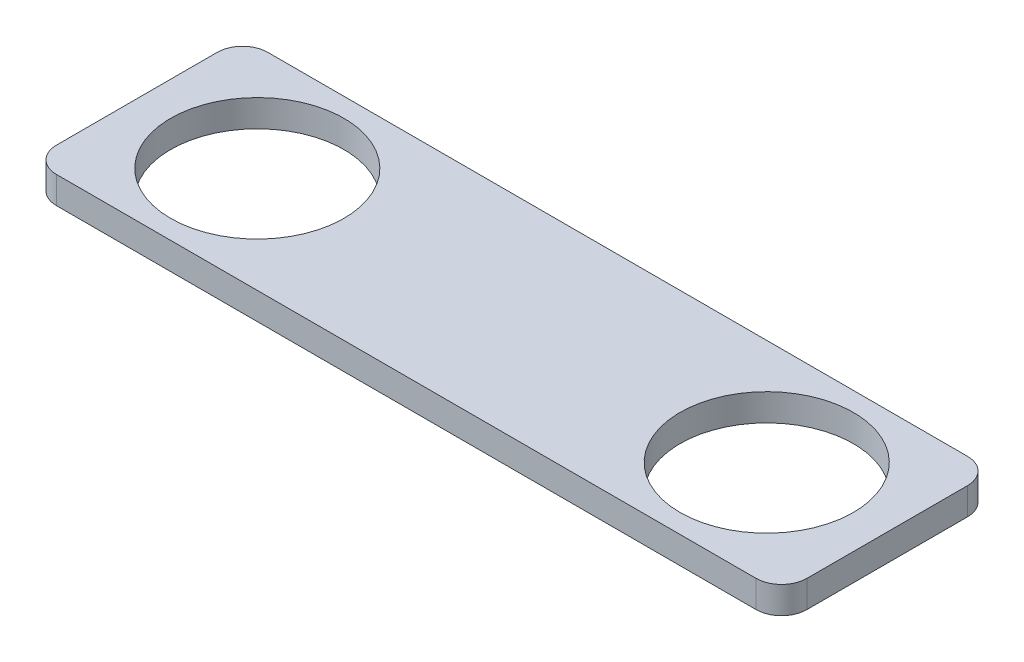
ISO-10303-21;
HEADER;
FILE_DESCRIPTION(('STEP AP214'),'2;1');
FILE_NAME('part.step','',(''),(''),'','','');
FILE_SCHEMA(('AUTOMOTIVE_DESIGN { 1 0 10303 214 1 1 1 1 }'));
ENDSEC;
DATA;
#1=APPLICATION_CONTEXT('core data for automotive mechanical design processes');
#2=APPLICATION_PROTOCOL_DEFINITION('international standard','automotive_design',2000,#1);
#3=PRODUCT_CONTEXT('',#1,'mechanical');
#4=PRODUCT('Part','Part','',(#3));
#5=PRODUCT_RELATED_PRODUCT_CATEGORY('part','',(#4));
#6=PRODUCT_DEFINITION_FORMATION('','',#4);
#7=PRODUCT_DEFINITION_CONTEXT('part definition',#1,'design');
#8=PRODUCT_DEFINITION('design','',#6,#7);
#9=PRODUCT_DEFINITION_SHAPE('','',#8);
#10=(LENGTH_UNIT() NAMED_UNIT(*) SI_UNIT(.MILLI.,.METRE.));
#11=(NAMED_UNIT(*) PLANE_ANGLE_UNIT() SI_UNIT($,.RADIAN.));
#12=(NAMED_UNIT(*) SI_UNIT($,.STERADIAN.) SOLID_ANGLE_UNIT());
#13=UNCERTAINTY_MEASURE_WITH_UNIT(LENGTH_MEASURE(1.E-05),#10,'distance_accuracy_value','');
#14=(GEOMETRIC_REPRESENTATION_CONTEXT(3) GLOBAL_UNCERTAINTY_ASSIGNED_CONTEXT((#13)) GLOBAL_UNIT_ASSIGNED_CONTEXT((#10,
#11,#12)) REPRESENTATION_CONTEXT('',''));
#15=CARTESIAN_POINT('',(0.,0.,0.));
#16=DIRECTION('',(0.,0.,1.));
#17=DIRECTION('',(1.,0.,0.));
#18=AXIS2_PLACEMENT_3D('',#15,#16,#17);
#19=CARTESIAN_POINT('',(-44.368,3.2,12.5));
#20=DIRECTION('',(1.,0.,0.));
#21=DIRECTION('',(0.,0.,1.));
#22=AXIS2_PLACEMENT_3D('',#19,#20,#21);
#23=PLANE('',#22);
#24=DIRECTION('',(0.,0.,1.));
#25=VECTOR('',#24,1.);
#26=CARTESIAN_POINT('',(-44.368,3.2,12.5));
#27=LINE('',#26,#25);
#28=CARTESIAN_POINT('',(-44.368,3.2,-9.5));
#29=VERTEX_POINT('',#28);
#30=CARTESIAN_POINT('',(-44.368,3.2,9.5));
#31=VERTEX_POINT('',#30);
#32=EDGE_CURVE('E164',#29,#31,#27,.T.);
#33=ORIENTED_EDGE('',*,*,#32,.F.);
#34=DIRECTION('',(0.,-1.,0.));
#35=VECTOR('',#34,1.);
#36=CARTESIAN_POINT('',(-44.368,3.2,-9.5));
#37=LINE('',#36,#35);
#38=CARTESIAN_POINT('',(-44.368,0.,-9.5));
#39=VERTEX_POINT('',#38);
#40=EDGE_CURVE('E11',#29,#39,#37,.T.);
#41=ORIENTED_EDGE('',*,*,#40,.T.);
#42=DIRECTION('',(0.,0.,-1.));
#43=VECTOR('',#42,1.);
#44=CARTESIAN_POINT('',(-44.368,0.,0.));
#45=LINE('',#44,#43);
#46=CARTESIAN_POINT('',(-44.368,0.,9.5));
#47=VERTEX_POINT('',#46);
#48=EDGE_CURVE('E165',#39,#47,#45,.F.);
#49=ORIENTED_EDGE('',*,*,#48,.T.);
#50=DIRECTION('',(0.,-1.,0.));
#51=VECTOR('',#50,1.);
#52=CARTESIAN_POINT('',(-44.368,3.2,9.5));
#53=LINE('',#52,#51);
#54=EDGE_CURVE('E58',#47,#31,#53,.F.);
#55=ORIENTED_EDGE('',*,*,#54,.T.);
#56=EDGE_LOOP('',(#33,#41,#49,#55));
#57=FACE_BOUND('',#56,.T.);
#58=ADVANCED_FACE('F49',(#57),#23,.F.);
#59=CARTESIAN_POINT('',(-44.368,3.2,12.5));
#60=DIRECTION('',(0.,0.,-1.));
#61=DIRECTION('',(1.,0.,0.));
#62=AXIS2_PLACEMENT_3D('',#59,#60,#61);
#63=PLANE('',#62);
#64=DIRECTION('',(1.,0.,0.));
#65=VECTOR('',#64,1.);
#66=CARTESIAN_POINT('',(0.,0.,12.5));
#67=LINE('',#66,#65);
#68=CARTESIAN_POINT('',(-41.368,0.,12.5));
#69=VERTEX_POINT('',#68);
#70=CARTESIAN_POINT('',(41.368,0.,12.5));
#71=VERTEX_POINT('',#70);
#72=EDGE_CURVE('E192',#69,#71,#67,.T.);
#73=ORIENTED_EDGE('',*,*,#72,.T.);
#74=DIRECTION('',(0.,-1.,0.));
#75=VECTOR('',#74,1.);
#76=CARTESIAN_POINT('',(41.368,3.2,12.5));
#77=LINE('',#76,#75);
#78=CARTESIAN_POINT('',(41.368,3.2,12.5));
#79=VERTEX_POINT('',#78);
#80=EDGE_CURVE('E143',#71,#79,#77,.F.);
#81=ORIENTED_EDGE('',*,*,#80,.T.);
#82=DIRECTION('',(1.,0.,0.));
#83=VECTOR('',#82,1.);
#84=CARTESIAN_POINT('',(-44.368,3.2,12.5));
#85=LINE('',#84,#83);
#86=CARTESIAN_POINT('',(-41.368,3.2,12.5));
#87=VERTEX_POINT('',#86);
#88=EDGE_CURVE('E176',#87,#79,#85,.T.);
#89=ORIENTED_EDGE('',*,*,#88,.F.);
#90=DIRECTION('',(0.,-1.,0.));
#91=VECTOR('',#90,1.);
#92=CARTESIAN_POINT('',(-41.368,3.2,12.5));
#93=LINE('',#92,#91);
#94=EDGE_CURVE('E150',#87,#69,#93,.T.);
#95=ORIENTED_EDGE('',*,*,#94,.T.);
#96=EDGE_LOOP('',(#73,#81,#89,#95));
#97=FACE_BOUND('',#96,.T.);
#98=ADVANCED_FACE('F227',(#97),#63,.F.);
#99=CARTESIAN_POINT('',(44.368,3.2,12.5));
#100=DIRECTION('',(-1.,0.,0.));
#101=DIRECTION('',(0.,0.,-1.));
#102=AXIS2_PLACEMENT_3D('',#99,#100,#101);
#103=PLANE('',#102);
#104=DIRECTION('',(0.,0.,-1.));
#105=VECTOR('',#104,1.);
#106=CARTESIAN_POINT('',(44.368,0.,0.));
#107=LINE('',#106,#105);
#108=CARTESIAN_POINT('',(44.368,0.,9.5));
#109=VERTEX_POINT('',#108);
#110=CARTESIAN_POINT('',(44.368,0.,-9.5));
#111=VERTEX_POINT('',#110);
#112=EDGE_CURVE('E120',#109,#111,#107,.T.);
#113=ORIENTED_EDGE('',*,*,#112,.T.);
#114=DIRECTION('',(0.,-1.,0.));
#115=VECTOR('',#114,1.);
#116=CARTESIAN_POINT('',(44.368,3.2,-9.5));
#117=LINE('',#116,#115);
#118=CARTESIAN_POINT('',(44.368,3.2,-9.5));
#119=VERTEX_POINT('',#118);
#120=EDGE_CURVE('E127',#111,#119,#117,.F.);
#121=ORIENTED_EDGE('',*,*,#120,.T.);
#122=DIRECTION('',(0.,0.,-1.));
#123=VECTOR('',#122,1.);
#124=CARTESIAN_POINT('',(44.368,3.2,12.5));
#125=LINE('',#124,#123);
#126=CARTESIAN_POINT('',(44.368,3.2,9.5));
#127=VERTEX_POINT('',#126);
#128=EDGE_CURVE('E123',#127,#119,#125,.T.);
#129=ORIENTED_EDGE('',*,*,#128,.F.);
#130=DIRECTION('',(0.,-1.,0.));
#131=VECTOR('',#130,1.);
#132=CARTESIAN_POINT('',(44.368,3.2,9.5));
#133=LINE('',#132,#131);
#134=EDGE_CURVE('E116',#127,#109,#133,.T.);
#135=ORIENTED_EDGE('',*,*,#134,.T.);
#136=EDGE_LOOP('',(#113,#121,#129,#135));
#137=FACE_BOUND('',#136,.T.);
#138=ADVANCED_FACE('F118',(#137),#103,.F.);
#139=CARTESIAN_POINT('',(-44.368,3.2,-12.5));
#140=DIRECTION('',(0.,0.,1.));
#141=DIRECTION('',(-1.,0.,0.));
#142=AXIS2_PLACEMENT_3D('',#139,#140,#141);
#143=PLANE('',#142);
#144=DIRECTION('',(-1.,0.,0.));
#145=VECTOR('',#144,1.);
#146=CARTESIAN_POINT('',(-44.368,3.2,-12.5));
#147=LINE('',#146,#145);
#148=CARTESIAN_POINT('',(41.368,3.2,-12.5));
#149=VERTEX_POINT('',#148);
#150=CARTESIAN_POINT('',(-41.368,3.2,-12.5));
#151=VERTEX_POINT('',#150);
#152=EDGE_CURVE('E177',#149,#151,#147,.T.);
#153=ORIENTED_EDGE('',*,*,#152,.F.);
#154=DIRECTION('',(0.,-1.,0.));
#155=VECTOR('',#154,1.);
#156=CARTESIAN_POINT('',(41.368,3.2,-12.5));
#157=LINE('',#156,#155);
#158=CARTESIAN_POINT('',(41.368,0.,-12.5));
#159=VERTEX_POINT('',#158);
#160=EDGE_CURVE('E221',#149,#159,#157,.T.);
#161=ORIENTED_EDGE('',*,*,#160,.T.);
#162=DIRECTION('',(1.,0.,0.));
#163=VECTOR('',#162,1.);
#164=CARTESIAN_POINT('',(0.,0.,-12.5));
#165=LINE('',#164,#163);
#166=CARTESIAN_POINT('',(-41.368,0.,-12.5));
#167=VERTEX_POINT('',#166);
#168=EDGE_CURVE('E138',#159,#167,#165,.F.);
#169=ORIENTED_EDGE('',*,*,#168,.T.);
#170=DIRECTION('',(0.,-1.,0.));
#171=VECTOR('',#170,1.);
#172=CARTESIAN_POINT('',(-41.368,3.2,-12.5));
#173=LINE('',#172,#171);
#174=EDGE_CURVE('E217',#167,#151,#173,.F.);
#175=ORIENTED_EDGE('',*,*,#174,.T.);
#176=EDGE_LOOP('',(#153,#161,#169,#175));
#177=FACE_BOUND('',#176,.T.);
#178=ADVANCED_FACE('F241',(#177),#143,.F.);
#179=CARTESIAN_POINT('',(30.118,3.2,0.));
#180=DIRECTION('',(0.,-1.,0.));
#181=DIRECTION('',(0.,0.,-1.));
#182=AXIS2_PLACEMENT_3D('',#179,#180,#181);
#183=CYLINDRICAL_SURFACE('',#182,10.25);
#184=CARTESIAN_POINT('',(30.118,3.2,0.));
#185=DIRECTION('',(0.,1.,0.));
#186=DIRECTION('',(0.,0.,1.));
#187=AXIS2_PLACEMENT_3D('',#184,#185,#186);
#188=CIRCLE('',#187,10.25);
#189=CARTESIAN_POINT('',(30.118,3.2,10.25));
#190=VERTEX_POINT('',#189);
#191=EDGE_CURVE('E180',#190,#190,#188,.T.);
#192=ORIENTED_EDGE('',*,*,#191,.T.);
#193=EDGE_LOOP('',(#192));
#194=FACE_BOUND('',#193,.T.);
#195=CARTESIAN_POINT('',(30.118,0.,0.));
#196=DIRECTION('',(0.,1.,0.));
#197=DIRECTION('',(0.,0.,1.));
#198=AXIS2_PLACEMENT_3D('',#195,#196,#197);
#199=CIRCLE('',#198,10.25);
#200=CARTESIAN_POINT('',(30.118,0.,10.25));
#201=VERTEX_POINT('',#200);
#202=EDGE_CURVE('E195',#201,#201,#199,.T.);
#203=ORIENTED_EDGE('',*,*,#202,.F.);
#204=EDGE_LOOP('',(#203));
#205=FACE_BOUND('',#204,.T.);
#206=ADVANCED_FACE('F244',(#194,#205),#183,.F.);
#207=CARTESIAN_POINT('',(-30.118,3.2,0.));
#208=DIRECTION('',(0.,-1.,0.));
#209=DIRECTION('',(0.,0.,-1.));
#210=AXIS2_PLACEMENT_3D('',#207,#208,#209);
#211=CYLINDRICAL_SURFACE('',#210,10.25);
#212=CARTESIAN_POINT('',(-30.118,3.2,0.));
#213=DIRECTION('',(0.,1.,0.));
#214=DIRECTION('',(0.,0.,1.));
#215=AXIS2_PLACEMENT_3D('',#212,#213,#214);
#216=CIRCLE('',#215,10.25);
#217=CARTESIAN_POINT('',(-30.118,3.2,10.25));
#218=VERTEX_POINT('',#217);
#219=EDGE_CURVE('E128',#218,#218,#216,.T.);
#220=ORIENTED_EDGE('',*,*,#219,.T.);
#221=EDGE_LOOP('',(#220));
#222=FACE_BOUND('',#221,.T.);
#223=CARTESIAN_POINT('',(-30.118,0.,0.));
#224=DIRECTION('',(0.,1.,0.));
#225=DIRECTION('',(0.,0.,1.));
#226=AXIS2_PLACEMENT_3D('',#223,#224,#225);
#227=CIRCLE('',#226,10.25);
#228=CARTESIAN_POINT('',(-30.118,0.,10.25));
#229=VERTEX_POINT('',#228);
#230=EDGE_CURVE('E203',#229,#229,#227,.T.);
#231=ORIENTED_EDGE('',*,*,#230,.F.);
#232=EDGE_LOOP('',(#231));
#233=FACE_BOUND('',#232,.T.);
#234=ADVANCED_FACE('F248',(#222,#233),#211,.F.);
#235=CARTESIAN_POINT('',(0.,3.2,0.));
#236=DIRECTION('',(0.,-1.,0.));
#237=DIRECTION('',(0.,0.,-1.));
#238=AXIS2_PLACEMENT_3D('',#235,#236,#237);
#239=PLANE('',#238);
#240=ORIENTED_EDGE('',*,*,#128,.T.);
#241=CARTESIAN_POINT('',(41.368,3.2,-9.5));
#242=DIRECTION('',(0.,-1.,0.));
#243=DIRECTION('',(0.,0.,-1.));
#244=AXIS2_PLACEMENT_3D('',#241,#242,#243);
#245=CIRCLE('',#244,3.);
#246=EDGE_CURVE('E214',#119,#149,#245,.F.);
#247=ORIENTED_EDGE('',*,*,#246,.T.);
#248=ORIENTED_EDGE('',*,*,#152,.T.);
#249=CARTESIAN_POINT('',(-41.368,3.2,-9.5));
#250=DIRECTION('',(0.,-1.,0.));
#251=DIRECTION('',(0.,0.,-1.));
#252=AXIS2_PLACEMENT_3D('',#249,#250,#251);
#253=CIRCLE('',#252,3.);
#254=EDGE_CURVE('E174',#151,#29,#253,.F.);
#255=ORIENTED_EDGE('',*,*,#254,.T.);
#256=ORIENTED_EDGE('',*,*,#32,.T.);
#257=CARTESIAN_POINT('',(-41.368,3.2,9.5));
#258=DIRECTION('',(0.,-1.,0.));
#259=DIRECTION('',(0.,0.,-1.));
#260=AXIS2_PLACEMENT_3D('',#257,#258,#259);
#261=CIRCLE('',#260,3.);
#262=EDGE_CURVE('E171',#31,#87,#261,.F.);
#263=ORIENTED_EDGE('',*,*,#262,.T.);
#264=ORIENTED_EDGE('',*,*,#88,.T.);
#265=CARTESIAN_POINT('',(41.368,3.2,9.5));
#266=DIRECTION('',(0.,-1.,0.));
#267=DIRECTION('',(0.,0.,-1.));
#268=AXIS2_PLACEMENT_3D('',#265,#266,#267);
#269=CIRCLE('',#268,3.);
#270=EDGE_CURVE('E211',#79,#127,#269,.F.);
#271=ORIENTED_EDGE('',*,*,#270,.T.);
#272=EDGE_LOOP('',(#240,#247,#248,#255,#256,#263,#264,#271));
#273=FACE_BOUND('',#272,.T.);
#274=ORIENTED_EDGE('',*,*,#191,.F.);
#275=EDGE_LOOP('',(#274));
#276=FACE_BOUND('',#275,.T.);
#277=ORIENTED_EDGE('',*,*,#219,.F.);
#278=EDGE_LOOP('',(#277));
#279=FACE_BOUND('',#278,.T.);
#280=ADVANCED_FACE('F168',(#273,#276,#279),#239,.F.);
#281=CARTESIAN_POINT('',(0.,0.,0.));
#282=DIRECTION('',(0.,-1.,0.));
#283=DIRECTION('',(0.,0.,-1.));
#284=AXIS2_PLACEMENT_3D('',#281,#282,#283);
#285=PLANE('',#284);
#286=ORIENTED_EDGE('',*,*,#168,.F.);
#287=CARTESIAN_POINT('',(41.368,0.,-9.5));
#288=DIRECTION('',(0.,-1.,0.));
#289=DIRECTION('',(0.,0.,-1.));
#290=AXIS2_PLACEMENT_3D('',#287,#288,#289);
#291=CIRCLE('',#290,3.);
#292=EDGE_CURVE('E136',#159,#111,#291,.T.);
#293=ORIENTED_EDGE('',*,*,#292,.T.);
#294=ORIENTED_EDGE('',*,*,#112,.F.);
#295=CARTESIAN_POINT('',(41.368,0.,9.5));
#296=DIRECTION('',(0.,-1.,0.));
#297=DIRECTION('',(0.,0.,-1.));
#298=AXIS2_PLACEMENT_3D('',#295,#296,#297);
#299=CIRCLE('',#298,3.);
#300=EDGE_CURVE('E133',#109,#71,#299,.T.);
#301=ORIENTED_EDGE('',*,*,#300,.T.);
#302=ORIENTED_EDGE('',*,*,#72,.F.);
#303=CARTESIAN_POINT('',(-41.368,0.,9.5));
#304=DIRECTION('',(0.,-1.,0.));
#305=DIRECTION('',(0.,0.,-1.));
#306=AXIS2_PLACEMENT_3D('',#303,#304,#305);
#307=CIRCLE('',#306,3.);
#308=EDGE_CURVE('E65',#69,#47,#307,.T.);
#309=ORIENTED_EDGE('',*,*,#308,.T.);
#310=ORIENTED_EDGE('',*,*,#48,.F.);
#311=CARTESIAN_POINT('',(-41.368,0.,-9.5));
#312=DIRECTION('',(0.,-1.,0.));
#313=DIRECTION('',(0.,0.,-1.));
#314=AXIS2_PLACEMENT_3D('',#311,#312,#313);
#315=CIRCLE('',#314,3.);
#316=EDGE_CURVE('E145',#39,#167,#315,.T.);
#317=ORIENTED_EDGE('',*,*,#316,.T.);
#318=EDGE_LOOP('',(#286,#293,#294,#301,#302,#309,#310,#317));
#319=FACE_BOUND('',#318,.T.);
#320=ORIENTED_EDGE('',*,*,#202,.T.);
#321=EDGE_LOOP('',(#320));
#322=FACE_BOUND('',#321,.T.);
#323=ORIENTED_EDGE('',*,*,#230,.T.);
#324=EDGE_LOOP('',(#323));
#325=FACE_BOUND('',#324,.T.);
#326=ADVANCED_FACE('F131',(#319,#322,#325),#285,.T.);
#327=CARTESIAN_POINT('',(41.368,3.2,-9.5));
#328=DIRECTION('',(0.,1.,0.));
#329=DIRECTION('',(0.,0.,1.));
#330=AXIS2_PLACEMENT_3D('',#327,#328,#329);
#331=CYLINDRICAL_SURFACE('',#330,3.);
#332=ORIENTED_EDGE('',*,*,#292,.F.);
#333=ORIENTED_EDGE('',*,*,#160,.F.);
#334=ORIENTED_EDGE('',*,*,#246,.F.);
#335=ORIENTED_EDGE('',*,*,#120,.F.);
#336=EDGE_LOOP('',(#332,#333,#334,#335));
#337=FACE_BOUND('',#336,.T.);
#338=ADVANCED_FACE('F253',(#337),#331,.T.);
#339=CARTESIAN_POINT('',(41.368,3.2,9.5));
#340=DIRECTION('',(0.,1.,0.));
#341=DIRECTION('',(0.,0.,1.));
#342=AXIS2_PLACEMENT_3D('',#339,#340,#341);
#343=CYLINDRICAL_SURFACE('',#342,3.);
#344=ORIENTED_EDGE('',*,*,#300,.F.);
#345=ORIENTED_EDGE('',*,*,#134,.F.);
#346=ORIENTED_EDGE('',*,*,#270,.F.);
#347=ORIENTED_EDGE('',*,*,#80,.F.);
#348=EDGE_LOOP('',(#344,#345,#346,#347));
#349=FACE_BOUND('',#348,.T.);
#350=ADVANCED_FACE('F141',(#349),#343,.T.);
#351=CARTESIAN_POINT('',(-41.368,3.2,-9.5));
#352=DIRECTION('',(0.,1.,0.));
#353=DIRECTION('',(0.,0.,1.));
#354=AXIS2_PLACEMENT_3D('',#351,#352,#353);
#355=CYLINDRICAL_SURFACE('',#354,3.);
#356=ORIENTED_EDGE('',*,*,#316,.F.);
#357=ORIENTED_EDGE('',*,*,#40,.F.);
#358=ORIENTED_EDGE('',*,*,#254,.F.);
#359=ORIENTED_EDGE('',*,*,#174,.F.);
#360=EDGE_LOOP('',(#356,#357,#358,#359));
#361=FACE_BOUND('',#360,.T.);
#362=ADVANCED_FACE('F230',(#361),#355,.T.);
#363=CARTESIAN_POINT('',(-41.368,3.2,9.5));
#364=DIRECTION('',(0.,1.,0.));
#365=DIRECTION('',(0.,0.,1.));
#366=AXIS2_PLACEMENT_3D('',#363,#364,#365);
#367=CYLINDRICAL_SURFACE('',#366,3.);
#368=ORIENTED_EDGE('',*,*,#308,.F.);
#369=ORIENTED_EDGE('',*,*,#94,.F.);
#370=ORIENTED_EDGE('',*,*,#262,.F.);
#371=ORIENTED_EDGE('',*,*,#54,.F.);
#372=EDGE_LOOP('',(#368,#369,#370,#371));
#373=FACE_BOUND('',#372,.T.);
#374=ADVANCED_FACE('F51',(#373),#367,.T.);
#375=CLOSED_SHELL('',(#58,#98,#138,#178,#206,#234,#280,#326,#338,#350,#362,#374));
#376=MANIFOLD_SOLID_BREP('B2',#375);
#377=ADVANCED_BREP_SHAPE_REPRESENTATION('',(#18,#376),#14);
#378=SHAPE_DEFINITION_REPRESENTATION(#9,#377);
ENDSEC;
END-ISO-10303-21;
